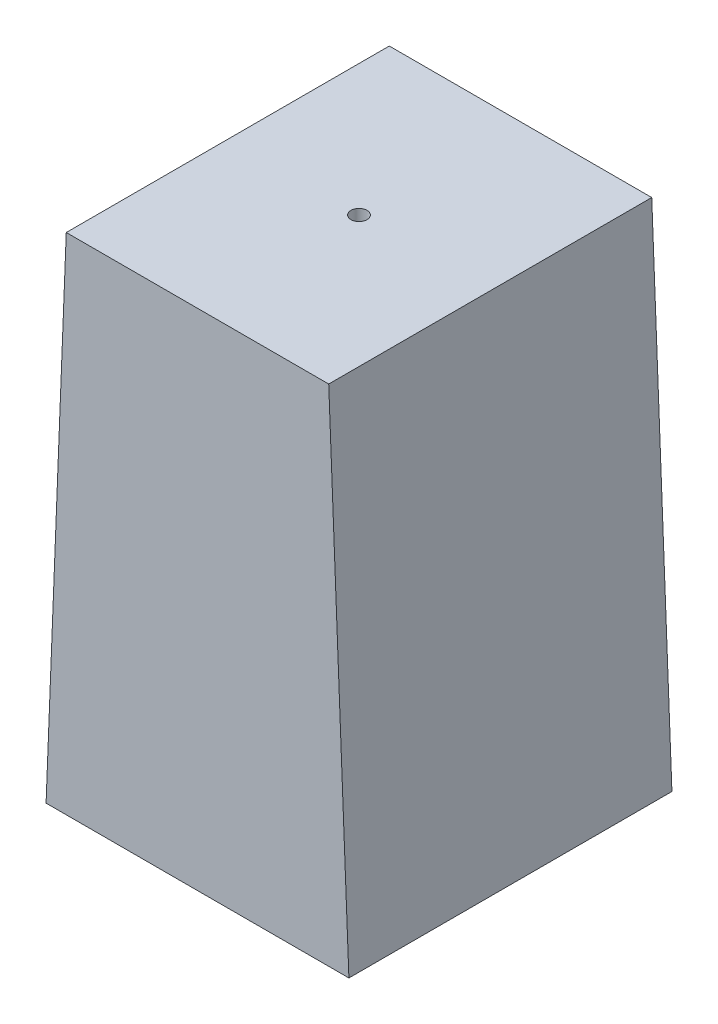
ISO-10303-21;
HEADER;
FILE_DESCRIPTION(('STEP AP214'),'2;1');
FILE_NAME('part.step','',(''),(''),'','','');
FILE_SCHEMA(('AUTOMOTIVE_DESIGN { 1 0 10303 214 1 1 1 1 }'));
ENDSEC;
DATA;
#1=APPLICATION_CONTEXT('core data for automotive mechanical design processes');
#2=APPLICATION_PROTOCOL_DEFINITION('international standard','automotive_design',2000,#1);
#3=PRODUCT_CONTEXT('',#1,'mechanical');
#4=PRODUCT('Part','Part','',(#3));
#5=PRODUCT_RELATED_PRODUCT_CATEGORY('part','',(#4));
#6=PRODUCT_DEFINITION_FORMATION('','',#4);
#7=PRODUCT_DEFINITION_CONTEXT('part definition',#1,'design');
#8=PRODUCT_DEFINITION('design','',#6,#7);
#9=PRODUCT_DEFINITION_SHAPE('','',#8);
#10=(LENGTH_UNIT() NAMED_UNIT(*) SI_UNIT(.MILLI.,.METRE.));
#11=(NAMED_UNIT(*) PLANE_ANGLE_UNIT() SI_UNIT($,.RADIAN.));
#12=(NAMED_UNIT(*) SI_UNIT($,.STERADIAN.) SOLID_ANGLE_UNIT());
#13=UNCERTAINTY_MEASURE_WITH_UNIT(LENGTH_MEASURE(1.E-05),#10,'distance_accuracy_value','');
#14=(GEOMETRIC_REPRESENTATION_CONTEXT(3) GLOBAL_UNCERTAINTY_ASSIGNED_CONTEXT((#13)) GLOBAL_UNIT_ASSIGNED_CONTEXT((#10,
#11,#12)) REPRESENTATION_CONTEXT('',''));
#15=CARTESIAN_POINT('',(0.,0.,0.));
#16=DIRECTION('',(0.,0.,1.));
#17=DIRECTION('',(1.,0.,0.));
#18=AXIS2_PLACEMENT_3D('',#15,#16,#17);
#19=CARTESIAN_POINT('',(0.,0.,16.));
#20=DIRECTION('',(0.,1.,0.));
#21=DIRECTION('',(0.,0.,1.));
#22=AXIS2_PLACEMENT_3D('',#19,#20,#21);
#23=PLANE('',#22);
#24=CARTESIAN_POINT('',(7.5,0.,8.));
#25=DIRECTION('',(0.,1.,0.));
#26=DIRECTION('',(0.,0.,1.));
#27=AXIS2_PLACEMENT_3D('',#24,#25,#26);
#28=CIRCLE('',#27,0.399999999999999);
#29=CARTESIAN_POINT('',(7.5,0.,8.4));
#30=VERTEX_POINT('',#29);
#31=EDGE_CURVE('E102',#30,#30,#28,.T.);
#32=ORIENTED_EDGE('',*,*,#31,.T.);
#33=EDGE_LOOP('',(#32));
#34=FACE_BOUND('',#33,.T.);
#35=DIRECTION('',(1.,0.,0.));
#36=VECTOR('',#35,1.);
#37=CARTESIAN_POINT('',(0.,0.,0.));
#38=LINE('',#37,#36);
#39=CARTESIAN_POINT('',(0.,0.,0.));
#40=VERTEX_POINT('',#39);
#41=CARTESIAN_POINT('',(15.,0.,0.));
#42=VERTEX_POINT('',#41);
#43=EDGE_CURVE('E100',#40,#42,#38,.T.);
#44=ORIENTED_EDGE('',*,*,#43,.T.);
#45=DIRECTION('',(0.,0.,-1.));
#46=VECTOR('',#45,1.);
#47=CARTESIAN_POINT('',(15.,0.,16.));
#48=LINE('',#47,#46);
#49=CARTESIAN_POINT('',(15.,0.,16.));
#50=VERTEX_POINT('',#49);
#51=EDGE_CURVE('E11',#50,#42,#48,.T.);
#52=ORIENTED_EDGE('',*,*,#51,.F.);
#53=DIRECTION('',(1.,0.,0.));
#54=VECTOR('',#53,1.);
#55=CARTESIAN_POINT('',(0.,0.,16.));
#56=LINE('',#55,#54);
#57=CARTESIAN_POINT('',(0.,0.,16.));
#58=VERTEX_POINT('',#57);
#59=EDGE_CURVE('E86',#58,#50,#56,.T.);
#60=ORIENTED_EDGE('',*,*,#59,.F.);
#61=DIRECTION('',(0.,0.,-1.));
#62=VECTOR('',#61,1.);
#63=CARTESIAN_POINT('',(0.,0.,16.));
#64=LINE('',#63,#62);
#65=EDGE_CURVE('E53',#58,#40,#64,.T.);
#66=ORIENTED_EDGE('',*,*,#65,.T.);
#67=EDGE_LOOP('',(#44,#52,#60,#66));
#68=FACE_BOUND('',#67,.T.);
#69=ADVANCED_FACE('F37',(#34,#68),#23,.F.);
#70=CARTESIAN_POINT('',(15.,0.,16.));
#71=DIRECTION('',(-0.999199679743744,-0.04,0.));
#72=DIRECTION('',(0.04,-0.999199679743744,0.));
#73=AXIS2_PLACEMENT_3D('',#70,#71,#72);
#74=PLANE('',#73);
#75=DIRECTION('',(-0.04,0.999199679743744,0.));
#76=VECTOR('',#75,1.);
#77=CARTESIAN_POINT('',(15.,0.,0.));
#78=LINE('',#77,#76);
#79=CARTESIAN_POINT('',(14.,24.9799919935936,0.));
#80=VERTEX_POINT('',#79);
#81=EDGE_CURVE('E91',#42,#80,#78,.T.);
#82=ORIENTED_EDGE('',*,*,#81,.T.);
#83=DIRECTION('',(0.,0.,-1.));
#84=VECTOR('',#83,1.);
#85=CARTESIAN_POINT('',(14.,24.9799919935936,16.));
#86=LINE('',#85,#84);
#87=CARTESIAN_POINT('',(14.,24.9799919935936,16.));
#88=VERTEX_POINT('',#87);
#89=EDGE_CURVE('E45',#88,#80,#86,.T.);
#90=ORIENTED_EDGE('',*,*,#89,.F.);
#91=DIRECTION('',(-0.04,0.999199679743744,0.));
#92=VECTOR('',#91,1.);
#93=CARTESIAN_POINT('',(15.,0.,16.));
#94=LINE('',#93,#92);
#95=EDGE_CURVE('E78',#50,#88,#94,.T.);
#96=ORIENTED_EDGE('',*,*,#95,.F.);
#97=ORIENTED_EDGE('',*,*,#51,.T.);
#98=EDGE_LOOP('',(#82,#90,#96,#97));
#99=FACE_BOUND('',#98,.T.);
#100=ADVANCED_FACE('F90',(#99),#74,.F.);
#101=CARTESIAN_POINT('',(1.,24.9799919935936,16.));
#102=DIRECTION('',(0.,1.,0.));
#103=DIRECTION('',(0.,0.,1.));
#104=AXIS2_PLACEMENT_3D('',#101,#102,#103);
#105=PLANE('',#104);
#106=CARTESIAN_POINT('',(7.5,24.9799919935936,8.));
#107=DIRECTION('',(0.,1.,0.));
#108=DIRECTION('',(0.,0.,1.));
#109=AXIS2_PLACEMENT_3D('',#106,#107,#108);
#110=CIRCLE('',#109,0.399999999999999);
#111=CARTESIAN_POINT('',(7.5,24.9799919935936,8.4));
#112=VERTEX_POINT('',#111);
#113=EDGE_CURVE('E114',#112,#112,#110,.T.);
#114=ORIENTED_EDGE('',*,*,#113,.F.);
#115=EDGE_LOOP('',(#114));
#116=FACE_BOUND('',#115,.T.);
#117=DIRECTION('',(1.,0.,0.));
#118=VECTOR('',#117,1.);
#119=CARTESIAN_POINT('',(1.,24.9799919935936,0.));
#120=LINE('',#119,#118);
#121=CARTESIAN_POINT('',(1.,24.9799919935936,0.));
#122=VERTEX_POINT('',#121);
#123=EDGE_CURVE('E104',#122,#80,#120,.T.);
#124=ORIENTED_EDGE('',*,*,#123,.F.);
#125=DIRECTION('',(0.,0.,-1.));
#126=VECTOR('',#125,1.);
#127=CARTESIAN_POINT('',(1.,24.9799919935936,16.));
#128=LINE('',#127,#126);
#129=CARTESIAN_POINT('',(1.,24.9799919935936,16.));
#130=VERTEX_POINT('',#129);
#131=EDGE_CURVE('E67',#130,#122,#128,.T.);
#132=ORIENTED_EDGE('',*,*,#131,.F.);
#133=DIRECTION('',(1.,0.,0.));
#134=VECTOR('',#133,1.);
#135=CARTESIAN_POINT('',(1.,24.9799919935936,16.));
#136=LINE('',#135,#134);
#137=EDGE_CURVE('E85',#130,#88,#136,.T.);
#138=ORIENTED_EDGE('',*,*,#137,.T.);
#139=ORIENTED_EDGE('',*,*,#89,.T.);
#140=EDGE_LOOP('',(#124,#132,#138,#139));
#141=FACE_BOUND('',#140,.T.);
#142=ADVANCED_FACE('F94',(#116,#141),#105,.T.);
#143=CARTESIAN_POINT('',(0.,0.,16.));
#144=DIRECTION('',(-0.999199679743744,0.04,0.));
#145=DIRECTION('',(-0.04,-0.999199679743744,0.));
#146=AXIS2_PLACEMENT_3D('',#143,#144,#145);
#147=PLANE('',#146);
#148=DIRECTION('',(0.04,0.999199679743744,0.));
#149=VECTOR('',#148,1.);
#150=CARTESIAN_POINT('',(0.,0.,0.));
#151=LINE('',#150,#149);
#152=EDGE_CURVE('E106',#40,#122,#151,.T.);
#153=ORIENTED_EDGE('',*,*,#152,.F.);
#154=ORIENTED_EDGE('',*,*,#65,.F.);
#155=DIRECTION('',(0.04,0.999199679743744,0.));
#156=VECTOR('',#155,1.);
#157=CARTESIAN_POINT('',(0.,0.,16.));
#158=LINE('',#157,#156);
#159=EDGE_CURVE('E95',#58,#130,#158,.T.);
#160=ORIENTED_EDGE('',*,*,#159,.T.);
#161=ORIENTED_EDGE('',*,*,#131,.T.);
#162=EDGE_LOOP('',(#153,#154,#160,#161));
#163=FACE_BOUND('',#162,.T.);
#164=ADVANCED_FACE('F122',(#163),#147,.T.);
#165=CARTESIAN_POINT('',(0.,0.,16.));
#166=DIRECTION('',(0.,0.,1.));
#167=DIRECTION('',(1.,0.,0.));
#168=AXIS2_PLACEMENT_3D('',#165,#166,#167);
#169=PLANE('',#168);
#170=ORIENTED_EDGE('',*,*,#59,.T.);
#171=ORIENTED_EDGE('',*,*,#95,.T.);
#172=ORIENTED_EDGE('',*,*,#137,.F.);
#173=ORIENTED_EDGE('',*,*,#159,.F.);
#174=EDGE_LOOP('',(#170,#171,#172,#173));
#175=FACE_BOUND('',#174,.T.);
#176=ADVANCED_FACE('F82',(#175),#169,.T.);
#177=CARTESIAN_POINT('',(0.,0.,0.));
#178=DIRECTION('',(0.,0.,1.));
#179=DIRECTION('',(1.,0.,0.));
#180=AXIS2_PLACEMENT_3D('',#177,#178,#179);
#181=PLANE('',#180);
#182=ORIENTED_EDGE('',*,*,#43,.F.);
#183=ORIENTED_EDGE('',*,*,#152,.T.);
#184=ORIENTED_EDGE('',*,*,#123,.T.);
#185=ORIENTED_EDGE('',*,*,#81,.F.);
#186=EDGE_LOOP('',(#182,#183,#184,#185));
#187=FACE_BOUND('',#186,.T.);
#188=ADVANCED_FACE('F134',(#187),#181,.F.);
#189=CARTESIAN_POINT('',(7.5,-7.02000800640641,8.));
#190=DIRECTION('',(0.,1.,0.));
#191=DIRECTION('',(0.,0.,1.));
#192=AXIS2_PLACEMENT_3D('',#189,#190,#191);
#193=CYLINDRICAL_SURFACE('',#192,0.399999999999999);
#194=ORIENTED_EDGE('',*,*,#113,.T.);
#195=EDGE_LOOP('',(#194));
#196=FACE_BOUND('',#195,.T.);
#197=ORIENTED_EDGE('',*,*,#31,.F.);
#198=EDGE_LOOP('',(#197));
#199=FACE_BOUND('',#198,.T.);
#200=ADVANCED_FACE('F118',(#196,#199),#193,.F.);
#201=CLOSED_SHELL('',(#69,#100,#142,#164,#176,#188,#200));
#202=MANIFOLD_SOLID_BREP('B2',#201);
#203=ADVANCED_BREP_SHAPE_REPRESENTATION('',(#18,#202),#14);
#204=SHAPE_DEFINITION_REPRESENTATION(#9,#203);
ENDSEC;
END-ISO-10303-21;
